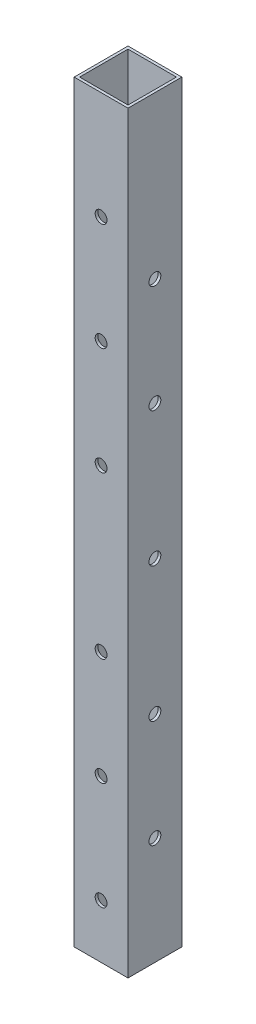
ISO-10303-21;
HEADER;
FILE_DESCRIPTION(('STEP AP214'),'2;1');
FILE_NAME('part.step','',(''),(''),'','','');
FILE_SCHEMA(('AUTOMOTIVE_DESIGN { 1 0 10303 214 1 1 1 1 }'));
ENDSEC;
DATA;
#1=APPLICATION_CONTEXT('core data for automotive mechanical design processes');
#2=APPLICATION_PROTOCOL_DEFINITION('international standard','automotive_design',2000,#1);
#3=PRODUCT_CONTEXT('',#1,'mechanical');
#4=PRODUCT('Part','Part','',(#3));
#5=PRODUCT_RELATED_PRODUCT_CATEGORY('part','',(#4));
#6=PRODUCT_DEFINITION_FORMATION('','',#4);
#7=PRODUCT_DEFINITION_CONTEXT('part definition',#1,'design');
#8=PRODUCT_DEFINITION('design','',#6,#7);
#9=PRODUCT_DEFINITION_SHAPE('','',#8);
#10=(LENGTH_UNIT() NAMED_UNIT(*) SI_UNIT(.MILLI.,.METRE.));
#11=(NAMED_UNIT(*) PLANE_ANGLE_UNIT() SI_UNIT($,.RADIAN.));
#12=(NAMED_UNIT(*) SI_UNIT($,.STERADIAN.) SOLID_ANGLE_UNIT());
#13=UNCERTAINTY_MEASURE_WITH_UNIT(LENGTH_MEASURE(1.E-05),#10,'distance_accuracy_value','');
#14=(GEOMETRIC_REPRESENTATION_CONTEXT(3) GLOBAL_UNCERTAINTY_ASSIGNED_CONTEXT((#13)) GLOBAL_UNIT_ASSIGNED_CONTEXT((#10,
#11,#12)) REPRESENTATION_CONTEXT('',''));
#15=CARTESIAN_POINT('',(0.,0.,0.));
#16=DIRECTION('',(0.,0.,1.));
#17=DIRECTION('',(1.,0.,0.));
#18=AXIS2_PLACEMENT_3D('',#15,#16,#17);
#19=CARTESIAN_POINT('',(0.,-280.,10.));
#20=DIRECTION('',(0.,0.,1.));
#21=DIRECTION('',(1.,0.,0.));
#22=AXIS2_PLACEMENT_3D('',#19,#20,#21);
#23=PLANE('',#22);
#24=CARTESIAN_POINT('',(0.,-40.,10.));
#25=DIRECTION('',(0.,0.,1.));
#26=DIRECTION('',(1.,0.,0.));
#27=AXIS2_PLACEMENT_3D('',#24,#25,#26);
#28=CIRCLE('',#27,2.2);
#29=CARTESIAN_POINT('',(2.19999999999997,-40.,10.));
#30=VERTEX_POINT('',#29);
#31=EDGE_CURVE('E201',#30,#30,#28,.T.);
#32=ORIENTED_EDGE('',*,*,#31,.F.);
#33=EDGE_LOOP('',(#32));
#34=FACE_BOUND('',#33,.T.);
#35=CARTESIAN_POINT('',(1.85733876412832E-12,-220.,10.));
#36=DIRECTION('',(0.,0.,1.));
#37=DIRECTION('',(1.,0.,0.));
#38=AXIS2_PLACEMENT_3D('',#35,#36,#37);
#39=CIRCLE('',#38,2.19999999999999);
#40=CARTESIAN_POINT('',(2.20000000000185,-220.,10.));
#41=VERTEX_POINT('',#40);
#42=EDGE_CURVE('E278',#41,#41,#39,.T.);
#43=ORIENTED_EDGE('',*,*,#42,.F.);
#44=EDGE_LOOP('',(#43));
#45=FACE_BOUND('',#44,.T.);
#46=CARTESIAN_POINT('',(8.09894362475382E-13,-120.,10.));
#47=DIRECTION('',(0.,0.,1.));
#48=DIRECTION('',(1.,0.,0.));
#49=AXIS2_PLACEMENT_3D('',#46,#47,#48);
#50=CIRCLE('',#49,2.2);
#51=CARTESIAN_POINT('',(2.20000000000081,-120.,10.));
#52=VERTEX_POINT('',#51);
#53=EDGE_CURVE('E273',#52,#52,#50,.T.);
#54=ORIENTED_EDGE('',*,*,#53,.F.);
#55=EDGE_LOOP('',(#54));
#56=FACE_BOUND('',#55,.T.);
#57=CARTESIAN_POINT('',(3.90916601814206E-13,-80.,10.));
#58=DIRECTION('',(0.,0.,1.));
#59=DIRECTION('',(1.,0.,0.));
#60=AXIS2_PLACEMENT_3D('',#57,#58,#59);
#61=CIRCLE('',#60,2.2);
#62=CARTESIAN_POINT('',(2.20000000000039,-80.,10.));
#63=VERTEX_POINT('',#62);
#64=EDGE_CURVE('E277',#63,#63,#61,.T.);
#65=ORIENTED_EDGE('',*,*,#64,.F.);
#66=EDGE_LOOP('',(#65));
#67=FACE_BOUND('',#66,.T.);
#68=CARTESIAN_POINT('',(1.43836100346715E-12,-180.,10.));
#69=DIRECTION('',(0.,0.,1.));
#70=DIRECTION('',(1.,0.,0.));
#71=AXIS2_PLACEMENT_3D('',#68,#69,#70);
#72=CIRCLE('',#71,2.19999999999999);
#73=CARTESIAN_POINT('',(2.20000000000143,-180.,10.));
#74=VERTEX_POINT('',#73);
#75=EDGE_CURVE('E272',#74,#74,#72,.T.);
#76=ORIENTED_EDGE('',*,*,#75,.F.);
#77=EDGE_LOOP('',(#76));
#78=FACE_BOUND('',#77,.T.);
#79=CARTESIAN_POINT('',(2.2763165247895E-12,-260.,10.));
#80=DIRECTION('',(0.,0.,1.));
#81=DIRECTION('',(1.,0.,0.));
#82=AXIS2_PLACEMENT_3D('',#79,#80,#81);
#83=CIRCLE('',#82,2.19999999999999);
#84=CARTESIAN_POINT('',(2.20000000000227,-260.,10.));
#85=VERTEX_POINT('',#84);
#86=EDGE_CURVE('E268',#85,#85,#83,.T.);
#87=ORIENTED_EDGE('',*,*,#86,.F.);
#88=EDGE_LOOP('',(#87));
#89=FACE_BOUND('',#88,.T.);
#90=DIRECTION('',(1.,0.,0.));
#91=VECTOR('',#90,1.);
#92=CARTESIAN_POINT('',(0.,0.,10.));
#93=LINE('',#92,#91);
#94=CARTESIAN_POINT('',(-10.0000000000001,0.,9.99999999999993));
#95=VERTEX_POINT('',#94);
#96=CARTESIAN_POINT('',(9.99999999999997,0.,10.));
#97=VERTEX_POINT('',#96);
#98=EDGE_CURVE('E162',#95,#97,#93,.T.);
#99=ORIENTED_EDGE('',*,*,#98,.F.);
#100=DIRECTION('',(0.,1.,0.));
#101=VECTOR('',#100,1.);
#102=CARTESIAN_POINT('',(-10.0000000000001,-280.,9.99999999999993));
#103=LINE('',#102,#101);
#104=CARTESIAN_POINT('',(-10.0000000000001,-280.,9.99999999999993));
#105=VERTEX_POINT('',#104);
#106=EDGE_CURVE('E48',#105,#95,#103,.T.);
#107=ORIENTED_EDGE('',*,*,#106,.F.);
#108=DIRECTION('',(1.,0.,0.));
#109=VECTOR('',#108,1.);
#110=CARTESIAN_POINT('',(0.,-280.,10.));
#111=LINE('',#110,#109);
#112=CARTESIAN_POINT('',(9.99999999999997,-280.,10.));
#113=VERTEX_POINT('',#112);
#114=EDGE_CURVE('E168',#105,#113,#111,.T.);
#115=ORIENTED_EDGE('',*,*,#114,.T.);
#116=DIRECTION('',(0.,1.,0.));
#117=VECTOR('',#116,1.);
#118=CARTESIAN_POINT('',(9.99999999999997,-280.,10.));
#119=LINE('',#118,#117);
#120=EDGE_CURVE('E11',#113,#97,#119,.T.);
#121=ORIENTED_EDGE('',*,*,#120,.T.);
#122=EDGE_LOOP('',(#99,#107,#115,#121));
#123=FACE_BOUND('',#122,.T.);
#124=ADVANCED_FACE('F38',(#34,#45,#56,#67,#78,#89,#123),#23,.T.);
#125=CARTESIAN_POINT('',(-10.,-280.,0.));
#126=DIRECTION('',(-1.,0.,0.));
#127=DIRECTION('',(0.,0.,1.));
#128=AXIS2_PLACEMENT_3D('',#125,#126,#127);
#129=PLANE('',#128);
#130=CARTESIAN_POINT('',(-10.,-60.,0.));
#131=DIRECTION('',(1.,0.,0.));
#132=DIRECTION('',(0.,0.,-1.));
#133=AXIS2_PLACEMENT_3D('',#130,#131,#132);
#134=CIRCLE('',#133,2.2);
#135=CARTESIAN_POINT('',(-10.,-60.,-2.2));
#136=VERTEX_POINT('',#135);
#137=EDGE_CURVE('E237',#136,#136,#134,.T.);
#138=ORIENTED_EDGE('',*,*,#137,.T.);
#139=EDGE_LOOP('',(#138));
#140=FACE_BOUND('',#139,.T.);
#141=CARTESIAN_POINT('',(-10.,-100.,0.));
#142=DIRECTION('',(1.,0.,0.));
#143=DIRECTION('',(0.,0.,-1.));
#144=AXIS2_PLACEMENT_3D('',#141,#142,#143);
#145=CIRCLE('',#144,2.2);
#146=CARTESIAN_POINT('',(-10.,-100.,-2.2));
#147=VERTEX_POINT('',#146);
#148=EDGE_CURVE('E496',#147,#147,#145,.T.);
#149=ORIENTED_EDGE('',*,*,#148,.T.);
#150=EDGE_LOOP('',(#149));
#151=FACE_BOUND('',#150,.T.);
#152=CARTESIAN_POINT('',(-10.,-150.,0.));
#153=DIRECTION('',(1.,0.,0.));
#154=DIRECTION('',(0.,0.,-1.));
#155=AXIS2_PLACEMENT_3D('',#152,#153,#154);
#156=CIRCLE('',#155,2.2);
#157=CARTESIAN_POINT('',(-10.,-150.,-2.20000000000001));
#158=VERTEX_POINT('',#157);
#159=EDGE_CURVE('E488',#158,#158,#156,.T.);
#160=ORIENTED_EDGE('',*,*,#159,.T.);
#161=EDGE_LOOP('',(#160));
#162=FACE_BOUND('',#161,.T.);
#163=CARTESIAN_POINT('',(-10.,-200.,0.));
#164=DIRECTION('',(1.,0.,0.));
#165=DIRECTION('',(0.,0.,-1.));
#166=AXIS2_PLACEMENT_3D('',#163,#164,#165);
#167=CIRCLE('',#166,2.2);
#168=CARTESIAN_POINT('',(-10.,-200.,-2.20000000000001));
#169=VERTEX_POINT('',#168);
#170=EDGE_CURVE('E480',#169,#169,#167,.T.);
#171=ORIENTED_EDGE('',*,*,#170,.T.);
#172=EDGE_LOOP('',(#171));
#173=FACE_BOUND('',#172,.T.);
#174=CARTESIAN_POINT('',(-10.,-240.,0.));
#175=DIRECTION('',(1.,0.,0.));
#176=DIRECTION('',(0.,0.,-1.));
#177=AXIS2_PLACEMENT_3D('',#174,#175,#176);
#178=CIRCLE('',#177,2.2);
#179=CARTESIAN_POINT('',(-10.,-240.,-2.20000000000001));
#180=VERTEX_POINT('',#179);
#181=EDGE_CURVE('E465',#180,#180,#178,.T.);
#182=ORIENTED_EDGE('',*,*,#181,.T.);
#183=EDGE_LOOP('',(#182));
#184=FACE_BOUND('',#183,.T.);
#185=DIRECTION('',(0.,0.,1.));
#186=VECTOR('',#185,1.);
#187=CARTESIAN_POINT('',(-10.,0.,0.));
#188=LINE('',#187,#186);
#189=CARTESIAN_POINT('',(-9.9999999999999,0.,-10.0000000000001));
#190=VERTEX_POINT('',#189);
#191=EDGE_CURVE('E179',#190,#95,#188,.T.);
#192=ORIENTED_EDGE('',*,*,#191,.F.);
#193=DIRECTION('',(0.,1.,0.));
#194=VECTOR('',#193,1.);
#195=CARTESIAN_POINT('',(-9.9999999999999,-280.,-10.0000000000001));
#196=LINE('',#195,#194);
#197=CARTESIAN_POINT('',(-9.9999999999999,-280.,-10.0000000000001));
#198=VERTEX_POINT('',#197);
#199=EDGE_CURVE('E189',#198,#190,#196,.T.);
#200=ORIENTED_EDGE('',*,*,#199,.F.);
#201=DIRECTION('',(0.,0.,1.));
#202=VECTOR('',#201,1.);
#203=CARTESIAN_POINT('',(-10.,-280.,0.));
#204=LINE('',#203,#202);
#205=EDGE_CURVE('E165',#198,#105,#204,.T.);
#206=ORIENTED_EDGE('',*,*,#205,.T.);
#207=ORIENTED_EDGE('',*,*,#106,.T.);
#208=EDGE_LOOP('',(#192,#200,#206,#207));
#209=FACE_BOUND('',#208,.T.);
#210=ADVANCED_FACE('F333',(#140,#151,#162,#173,#184,#209),#129,.T.);
#211=CARTESIAN_POINT('',(0.,-280.,-10.));
#212=DIRECTION('',(0.,0.,-1.));
#213=DIRECTION('',(-1.,0.,0.));
#214=AXIS2_PLACEMENT_3D('',#211,#212,#213);
#215=PLANE('',#214);
#216=CARTESIAN_POINT('',(0.,-40.,-10.));
#217=DIRECTION('',(0.,0.,-1.));
#218=DIRECTION('',(-1.,0.,0.));
#219=AXIS2_PLACEMENT_3D('',#216,#217,#218);
#220=CIRCLE('',#219,2.2);
#221=CARTESIAN_POINT('',(-2.20000000000003,-40.,-10.));
#222=VERTEX_POINT('',#221);
#223=EDGE_CURVE('E142',#222,#222,#220,.T.);
#224=ORIENTED_EDGE('',*,*,#223,.F.);
#225=EDGE_LOOP('',(#224));
#226=FACE_BOUND('',#225,.T.);
#227=CARTESIAN_POINT('',(1.85733876412832E-12,-220.,-10.));
#228=DIRECTION('',(0.,0.,-1.));
#229=DIRECTION('',(-1.,0.,0.));
#230=AXIS2_PLACEMENT_3D('',#227,#228,#229);
#231=CIRCLE('',#230,2.19999999999999);
#232=CARTESIAN_POINT('',(-2.19999999999814,-220.,-10.));
#233=VERTEX_POINT('',#232);
#234=EDGE_CURVE('E231',#233,#233,#231,.T.);
#235=ORIENTED_EDGE('',*,*,#234,.F.);
#236=EDGE_LOOP('',(#235));
#237=FACE_BOUND('',#236,.T.);
#238=CARTESIAN_POINT('',(8.09894362475382E-13,-120.,-10.));
#239=DIRECTION('',(0.,0.,-1.));
#240=DIRECTION('',(-1.,0.,0.));
#241=AXIS2_PLACEMENT_3D('',#238,#239,#240);
#242=CIRCLE('',#241,2.2);
#243=CARTESIAN_POINT('',(-2.19999999999919,-120.,-10.));
#244=VERTEX_POINT('',#243);
#245=EDGE_CURVE('E225',#244,#244,#242,.T.);
#246=ORIENTED_EDGE('',*,*,#245,.F.);
#247=EDGE_LOOP('',(#246));
#248=FACE_BOUND('',#247,.T.);
#249=CARTESIAN_POINT('',(3.90916601814206E-13,-80.,-10.));
#250=DIRECTION('',(0.,0.,-1.));
#251=DIRECTION('',(-1.,0.,0.));
#252=AXIS2_PLACEMENT_3D('',#249,#250,#251);
#253=CIRCLE('',#252,2.2);
#254=CARTESIAN_POINT('',(-2.19999999999961,-80.,-10.));
#255=VERTEX_POINT('',#254);
#256=EDGE_CURVE('E219',#255,#255,#253,.T.);
#257=ORIENTED_EDGE('',*,*,#256,.F.);
#258=EDGE_LOOP('',(#257));
#259=FACE_BOUND('',#258,.T.);
#260=CARTESIAN_POINT('',(1.43836100346715E-12,-180.,-10.));
#261=DIRECTION('',(0.,0.,-1.));
#262=DIRECTION('',(-1.,0.,0.));
#263=AXIS2_PLACEMENT_3D('',#260,#261,#262);
#264=CIRCLE('',#263,2.19999999999999);
#265=CARTESIAN_POINT('',(-2.19999999999856,-180.,-10.));
#266=VERTEX_POINT('',#265);
#267=EDGE_CURVE('E213',#266,#266,#264,.T.);
#268=ORIENTED_EDGE('',*,*,#267,.F.);
#269=EDGE_LOOP('',(#268));
#270=FACE_BOUND('',#269,.T.);
#271=CARTESIAN_POINT('',(2.2763165247895E-12,-260.,-10.));
#272=DIRECTION('',(0.,0.,-1.));
#273=DIRECTION('',(-1.,0.,0.));
#274=AXIS2_PLACEMENT_3D('',#271,#272,#273);
#275=CIRCLE('',#274,2.19999999999999);
#276=CARTESIAN_POINT('',(-2.19999999999772,-260.,-10.));
#277=VERTEX_POINT('',#276);
#278=EDGE_CURVE('E207',#277,#277,#275,.T.);
#279=ORIENTED_EDGE('',*,*,#278,.F.);
#280=EDGE_LOOP('',(#279));
#281=FACE_BOUND('',#280,.T.);
#282=DIRECTION('',(-1.,0.,0.));
#283=VECTOR('',#282,1.);
#284=CARTESIAN_POINT('',(0.,0.,-10.));
#285=LINE('',#284,#283);
#286=CARTESIAN_POINT('',(10.,0.,-10.));
#287=VERTEX_POINT('',#286);
#288=EDGE_CURVE('E175',#287,#190,#285,.T.);
#289=ORIENTED_EDGE('',*,*,#288,.F.);
#290=DIRECTION('',(0.,1.,0.));
#291=VECTOR('',#290,1.);
#292=CARTESIAN_POINT('',(10.,-280.,-10.));
#293=LINE('',#292,#291);
#294=CARTESIAN_POINT('',(10.,-280.,-10.));
#295=VERTEX_POINT('',#294);
#296=EDGE_CURVE('E171',#295,#287,#293,.T.);
#297=ORIENTED_EDGE('',*,*,#296,.F.);
#298=DIRECTION('',(-1.,0.,0.));
#299=VECTOR('',#298,1.);
#300=CARTESIAN_POINT('',(0.,-280.,-10.));
#301=LINE('',#300,#299);
#302=EDGE_CURVE('E161',#295,#198,#301,.T.);
#303=ORIENTED_EDGE('',*,*,#302,.T.);
#304=ORIENTED_EDGE('',*,*,#199,.T.);
#305=EDGE_LOOP('',(#289,#297,#303,#304));
#306=FACE_BOUND('',#305,.T.);
#307=ADVANCED_FACE('F330',(#226,#237,#248,#259,#270,#281,#306),#215,.T.);
#308=CARTESIAN_POINT('',(10.,-280.,0.));
#309=DIRECTION('',(1.,0.,0.));
#310=DIRECTION('',(0.,0.,-1.));
#311=AXIS2_PLACEMENT_3D('',#308,#309,#310);
#312=PLANE('',#311);
#313=CARTESIAN_POINT('',(10.,-60.,0.));
#314=DIRECTION('',(1.,0.,0.));
#315=DIRECTION('',(0.,0.,-1.));
#316=AXIS2_PLACEMENT_3D('',#313,#314,#315);
#317=CIRCLE('',#316,2.2);
#318=CARTESIAN_POINT('',(10.,-60.,-2.2));
#319=VERTEX_POINT('',#318);
#320=EDGE_CURVE('E500',#319,#319,#317,.T.);
#321=ORIENTED_EDGE('',*,*,#320,.F.);
#322=EDGE_LOOP('',(#321));
#323=FACE_BOUND('',#322,.T.);
#324=CARTESIAN_POINT('',(10.,-100.,0.));
#325=DIRECTION('',(1.,0.,0.));
#326=DIRECTION('',(0.,0.,-1.));
#327=AXIS2_PLACEMENT_3D('',#324,#325,#326);
#328=CIRCLE('',#327,2.2);
#329=CARTESIAN_POINT('',(10.,-100.,-2.2));
#330=VERTEX_POINT('',#329);
#331=EDGE_CURVE('E492',#330,#330,#328,.T.);
#332=ORIENTED_EDGE('',*,*,#331,.F.);
#333=EDGE_LOOP('',(#332));
#334=FACE_BOUND('',#333,.T.);
#335=CARTESIAN_POINT('',(10.,-150.,0.));
#336=DIRECTION('',(1.,0.,0.));
#337=DIRECTION('',(0.,0.,-1.));
#338=AXIS2_PLACEMENT_3D('',#335,#336,#337);
#339=CIRCLE('',#338,2.2);
#340=CARTESIAN_POINT('',(10.,-150.,-2.20000000000001));
#341=VERTEX_POINT('',#340);
#342=EDGE_CURVE('E484',#341,#341,#339,.T.);
#343=ORIENTED_EDGE('',*,*,#342,.F.);
#344=EDGE_LOOP('',(#343));
#345=FACE_BOUND('',#344,.T.);
#346=CARTESIAN_POINT('',(10.,-200.,0.));
#347=DIRECTION('',(1.,0.,0.));
#348=DIRECTION('',(0.,0.,-1.));
#349=AXIS2_PLACEMENT_3D('',#346,#347,#348);
#350=CIRCLE('',#349,2.2);
#351=CARTESIAN_POINT('',(10.,-200.,-2.20000000000001));
#352=VERTEX_POINT('',#351);
#353=EDGE_CURVE('E476',#352,#352,#350,.T.);
#354=ORIENTED_EDGE('',*,*,#353,.F.);
#355=EDGE_LOOP('',(#354));
#356=FACE_BOUND('',#355,.T.);
#357=CARTESIAN_POINT('',(10.,-240.,0.));
#358=DIRECTION('',(1.,0.,0.));
#359=DIRECTION('',(0.,0.,-1.));
#360=AXIS2_PLACEMENT_3D('',#357,#358,#359);
#361=CIRCLE('',#360,2.2);
#362=CARTESIAN_POINT('',(10.,-240.,-2.20000000000001));
#363=VERTEX_POINT('',#362);
#364=EDGE_CURVE('E471',#363,#363,#361,.T.);
#365=ORIENTED_EDGE('',*,*,#364,.F.);
#366=EDGE_LOOP('',(#365));
#367=FACE_BOUND('',#366,.T.);
#368=DIRECTION('',(0.,0.,-1.));
#369=VECTOR('',#368,1.);
#370=CARTESIAN_POINT('',(10.,0.,0.));
#371=LINE('',#370,#369);
#372=EDGE_CURVE('E153',#97,#287,#371,.T.);
#373=ORIENTED_EDGE('',*,*,#372,.F.);
#374=ORIENTED_EDGE('',*,*,#120,.F.);
#375=DIRECTION('',(0.,0.,-1.));
#376=VECTOR('',#375,1.);
#377=CARTESIAN_POINT('',(10.,-280.,0.));
#378=LINE('',#377,#376);
#379=EDGE_CURVE('E158',#113,#295,#378,.T.);
#380=ORIENTED_EDGE('',*,*,#379,.T.);
#381=ORIENTED_EDGE('',*,*,#296,.T.);
#382=EDGE_LOOP('',(#373,#374,#380,#381));
#383=FACE_BOUND('',#382,.T.);
#384=ADVANCED_FACE('F40',(#323,#334,#345,#356,#367,#383),#312,.T.);
#385=CARTESIAN_POINT('',(0.,-280.,0.));
#386=DIRECTION('',(0.,1.,0.));
#387=DIRECTION('',(0.,0.,1.));
#388=AXIS2_PLACEMENT_3D('',#385,#386,#387);
#389=PLANE('',#388);
#390=DIRECTION('',(0.,0.,1.));
#391=VECTOR('',#390,1.);
#392=CARTESIAN_POINT('',(-9.,-280.,0.));
#393=LINE('',#392,#391);
#394=CARTESIAN_POINT('',(-8.99999999999991,-280.,-9.00000000000009));
#395=VERTEX_POINT('',#394);
#396=CARTESIAN_POINT('',(-9.00000000000006,-280.,8.99999999999994));
#397=VERTEX_POINT('',#396);
#398=EDGE_CURVE('E117',#395,#397,#393,.T.);
#399=ORIENTED_EDGE('',*,*,#398,.T.);
#400=DIRECTION('',(1.,0.,0.));
#401=VECTOR('',#400,1.);
#402=CARTESIAN_POINT('',(0.,-280.,9.));
#403=LINE('',#402,#401);
#404=CARTESIAN_POINT('',(8.99999999999997,-280.,9.00000000000003));
#405=VERTEX_POINT('',#404);
#406=EDGE_CURVE('E123',#397,#405,#403,.T.);
#407=ORIENTED_EDGE('',*,*,#406,.T.);
#408=DIRECTION('',(0.,0.,-1.));
#409=VECTOR('',#408,1.);
#410=CARTESIAN_POINT('',(9.,-280.,0.));
#411=LINE('',#410,#409);
#412=CARTESIAN_POINT('',(9.,-280.,-9.));
#413=VERTEX_POINT('',#412);
#414=EDGE_CURVE('E129',#405,#413,#411,.T.);
#415=ORIENTED_EDGE('',*,*,#414,.T.);
#416=DIRECTION('',(-1.,0.,0.));
#417=VECTOR('',#416,1.);
#418=CARTESIAN_POINT('',(0.,-280.,-9.));
#419=LINE('',#418,#417);
#420=EDGE_CURVE('E56',#413,#395,#419,.T.);
#421=ORIENTED_EDGE('',*,*,#420,.T.);
#422=EDGE_LOOP('',(#399,#407,#415,#421));
#423=FACE_BOUND('',#422,.T.);
#424=ORIENTED_EDGE('',*,*,#379,.F.);
#425=ORIENTED_EDGE('',*,*,#114,.F.);
#426=ORIENTED_EDGE('',*,*,#205,.F.);
#427=ORIENTED_EDGE('',*,*,#302,.F.);
#428=EDGE_LOOP('',(#424,#425,#426,#427));
#429=FACE_BOUND('',#428,.T.);
#430=ADVANCED_FACE('F126',(#423,#429),#389,.F.);
#431=CARTESIAN_POINT('',(0.,0.,0.));
#432=DIRECTION('',(0.,1.,0.));
#433=DIRECTION('',(0.,0.,1.));
#434=AXIS2_PLACEMENT_3D('',#431,#432,#433);
#435=PLANE('',#434);
#436=DIRECTION('',(1.,0.,0.));
#437=VECTOR('',#436,1.);
#438=CARTESIAN_POINT('',(0.,0.,9.));
#439=LINE('',#438,#437);
#440=CARTESIAN_POINT('',(-9.00000000000006,0.,8.99999999999994));
#441=VERTEX_POINT('',#440);
#442=CARTESIAN_POINT('',(9.,0.,9.00000000000003));
#443=VERTEX_POINT('',#442);
#444=EDGE_CURVE('E64',#441,#443,#439,.T.);
#445=ORIENTED_EDGE('',*,*,#444,.F.);
#446=DIRECTION('',(0.,0.,1.));
#447=VECTOR('',#446,1.);
#448=CARTESIAN_POINT('',(-9.,0.,0.));
#449=LINE('',#448,#447);
#450=CARTESIAN_POINT('',(-8.99999999999991,0.,-9.00000000000009));
#451=VERTEX_POINT('',#450);
#452=EDGE_CURVE('E145',#451,#441,#449,.T.);
#453=ORIENTED_EDGE('',*,*,#452,.F.);
#454=DIRECTION('',(-1.,0.,0.));
#455=VECTOR('',#454,1.);
#456=CARTESIAN_POINT('',(0.,0.,-9.));
#457=LINE('',#456,#455);
#458=CARTESIAN_POINT('',(9.,0.,-9.));
#459=VERTEX_POINT('',#458);
#460=EDGE_CURVE('E108',#459,#451,#457,.T.);
#461=ORIENTED_EDGE('',*,*,#460,.F.);
#462=DIRECTION('',(0.,0.,-1.));
#463=VECTOR('',#462,1.);
#464=CARTESIAN_POINT('',(9.,0.,0.));
#465=LINE('',#464,#463);
#466=EDGE_CURVE('E138',#443,#459,#465,.T.);
#467=ORIENTED_EDGE('',*,*,#466,.F.);
#468=EDGE_LOOP('',(#445,#453,#461,#467));
#469=FACE_BOUND('',#468,.T.);
#470=ORIENTED_EDGE('',*,*,#98,.T.);
#471=ORIENTED_EDGE('',*,*,#372,.T.);
#472=ORIENTED_EDGE('',*,*,#288,.T.);
#473=ORIENTED_EDGE('',*,*,#191,.T.);
#474=EDGE_LOOP('',(#470,#471,#472,#473));
#475=FACE_BOUND('',#474,.T.);
#476=ADVANCED_FACE('F351',(#469,#475),#435,.T.);
#477=CARTESIAN_POINT('',(0.,-280.,9.));
#478=DIRECTION('',(0.,0.,1.));
#479=DIRECTION('',(1.,0.,0.));
#480=AXIS2_PLACEMENT_3D('',#477,#478,#479);
#481=PLANE('',#480);
#482=CARTESIAN_POINT('',(0.,-40.,9.00000000000001));
#483=DIRECTION('',(0.,0.,1.));
#484=DIRECTION('',(1.,0.,0.));
#485=AXIS2_PLACEMENT_3D('',#482,#483,#484);
#486=CIRCLE('',#485,2.2);
#487=CARTESIAN_POINT('',(2.19999999999997,-40.,9.00000000000001));
#488=VERTEX_POINT('',#487);
#489=EDGE_CURVE('E230',#488,#488,#486,.T.);
#490=ORIENTED_EDGE('',*,*,#489,.T.);
#491=EDGE_LOOP('',(#490));
#492=FACE_BOUND('',#491,.T.);
#493=CARTESIAN_POINT('',(1.85733876412832E-12,-220.,9.00000000000001));
#494=DIRECTION('',(0.,0.,1.));
#495=DIRECTION('',(1.,0.,0.));
#496=AXIS2_PLACEMENT_3D('',#493,#494,#495);
#497=CIRCLE('',#496,2.19999999999999);
#498=CARTESIAN_POINT('',(2.20000000000185,-220.,9.00000000000001));
#499=VERTEX_POINT('',#498);
#500=EDGE_CURVE('E224',#499,#499,#497,.T.);
#501=ORIENTED_EDGE('',*,*,#500,.T.);
#502=EDGE_LOOP('',(#501));
#503=FACE_BOUND('',#502,.T.);
#504=CARTESIAN_POINT('',(8.09894362475382E-13,-120.,9.00000000000001));
#505=DIRECTION('',(0.,0.,1.));
#506=DIRECTION('',(1.,0.,0.));
#507=AXIS2_PLACEMENT_3D('',#504,#505,#506);
#508=CIRCLE('',#507,2.2);
#509=CARTESIAN_POINT('',(2.20000000000081,-120.,9.00000000000001));
#510=VERTEX_POINT('',#509);
#511=EDGE_CURVE('E218',#510,#510,#508,.T.);
#512=ORIENTED_EDGE('',*,*,#511,.T.);
#513=EDGE_LOOP('',(#512));
#514=FACE_BOUND('',#513,.T.);
#515=CARTESIAN_POINT('',(3.90916601814206E-13,-80.,9.00000000000001));
#516=DIRECTION('',(0.,0.,1.));
#517=DIRECTION('',(1.,0.,0.));
#518=AXIS2_PLACEMENT_3D('',#515,#516,#517);
#519=CIRCLE('',#518,2.2);
#520=CARTESIAN_POINT('',(2.20000000000039,-80.,9.00000000000001));
#521=VERTEX_POINT('',#520);
#522=EDGE_CURVE('E212',#521,#521,#519,.T.);
#523=ORIENTED_EDGE('',*,*,#522,.T.);
#524=EDGE_LOOP('',(#523));
#525=FACE_BOUND('',#524,.T.);
#526=CARTESIAN_POINT('',(1.43836100346715E-12,-180.,9.00000000000001));
#527=DIRECTION('',(0.,0.,1.));
#528=DIRECTION('',(1.,0.,0.));
#529=AXIS2_PLACEMENT_3D('',#526,#527,#528);
#530=CIRCLE('',#529,2.19999999999999);
#531=CARTESIAN_POINT('',(2.20000000000143,-180.,9.00000000000001));
#532=VERTEX_POINT('',#531);
#533=EDGE_CURVE('E206',#532,#532,#530,.T.);
#534=ORIENTED_EDGE('',*,*,#533,.T.);
#535=EDGE_LOOP('',(#534));
#536=FACE_BOUND('',#535,.T.);
#537=CARTESIAN_POINT('',(2.2763165247895E-12,-260.,9.00000000000001));
#538=DIRECTION('',(0.,0.,1.));
#539=DIRECTION('',(1.,0.,0.));
#540=AXIS2_PLACEMENT_3D('',#537,#538,#539);
#541=CIRCLE('',#540,2.19999999999999);
#542=CARTESIAN_POINT('',(2.20000000000227,-260.,9.00000000000001));
#543=VERTEX_POINT('',#542);
#544=EDGE_CURVE('E200',#543,#543,#541,.T.);
#545=ORIENTED_EDGE('',*,*,#544,.T.);
#546=EDGE_LOOP('',(#545));
#547=FACE_BOUND('',#546,.T.);
#548=ORIENTED_EDGE('',*,*,#444,.T.);
#549=DIRECTION('',(0.,1.,0.));
#550=VECTOR('',#549,1.);
#551=CARTESIAN_POINT('',(8.99999999999997,-280.,9.00000000000003));
#552=LINE('',#551,#550);
#553=EDGE_CURVE('E150',#405,#443,#552,.T.);
#554=ORIENTED_EDGE('',*,*,#553,.F.);
#555=ORIENTED_EDGE('',*,*,#406,.F.);
#556=DIRECTION('',(0.,1.,0.));
#557=VECTOR('',#556,1.);
#558=CARTESIAN_POINT('',(-9.00000000000006,-280.,8.99999999999994));
#559=LINE('',#558,#557);
#560=EDGE_CURVE('E113',#397,#441,#559,.T.);
#561=ORIENTED_EDGE('',*,*,#560,.T.);
#562=EDGE_LOOP('',(#548,#554,#555,#561));
#563=FACE_BOUND('',#562,.T.);
#564=ADVANCED_FACE('F363',(#492,#503,#514,#525,#536,#547,#563),#481,.F.);
#565=CARTESIAN_POINT('',(-9.,-280.,0.));
#566=DIRECTION('',(-1.,0.,0.));
#567=DIRECTION('',(0.,0.,1.));
#568=AXIS2_PLACEMENT_3D('',#565,#566,#567);
#569=PLANE('',#568);
#570=CARTESIAN_POINT('',(-9.,-60.,0.));
#571=DIRECTION('',(-1.,0.,0.));
#572=DIRECTION('',(0.,0.,1.));
#573=AXIS2_PLACEMENT_3D('',#570,#571,#572);
#574=CIRCLE('',#573,2.2);
#575=CARTESIAN_POINT('',(-9.00000000000001,-60.,2.2));
#576=VERTEX_POINT('',#575);
#577=EDGE_CURVE('E264',#576,#576,#574,.T.);
#578=ORIENTED_EDGE('',*,*,#577,.T.);
#579=EDGE_LOOP('',(#578));
#580=FACE_BOUND('',#579,.T.);
#581=CARTESIAN_POINT('',(-9.,-100.,0.));
#582=DIRECTION('',(-1.,0.,0.));
#583=DIRECTION('',(0.,0.,1.));
#584=AXIS2_PLACEMENT_3D('',#581,#582,#583);
#585=CIRCLE('',#584,2.2);
#586=CARTESIAN_POINT('',(-9.00000000000001,-100.,2.19999999999999));
#587=VERTEX_POINT('',#586);
#588=EDGE_CURVE('E250',#587,#587,#585,.T.);
#589=ORIENTED_EDGE('',*,*,#588,.T.);
#590=EDGE_LOOP('',(#589));
#591=FACE_BOUND('',#590,.T.);
#592=CARTESIAN_POINT('',(-9.,-150.,0.));
#593=DIRECTION('',(-1.,0.,0.));
#594=DIRECTION('',(0.,0.,1.));
#595=AXIS2_PLACEMENT_3D('',#592,#593,#594);
#596=CIRCLE('',#595,2.2);
#597=CARTESIAN_POINT('',(-9.00000000000001,-150.,2.2));
#598=VERTEX_POINT('',#597);
#599=EDGE_CURVE('E246',#598,#598,#596,.T.);
#600=ORIENTED_EDGE('',*,*,#599,.T.);
#601=EDGE_LOOP('',(#600));
#602=FACE_BOUND('',#601,.T.);
#603=CARTESIAN_POINT('',(-9.,-200.,0.));
#604=DIRECTION('',(-1.,0.,0.));
#605=DIRECTION('',(0.,0.,1.));
#606=AXIS2_PLACEMENT_3D('',#603,#604,#605);
#607=CIRCLE('',#606,2.2);
#608=CARTESIAN_POINT('',(-9.00000000000001,-200.,2.2));
#609=VERTEX_POINT('',#608);
#610=EDGE_CURVE('E242',#609,#609,#607,.T.);
#611=ORIENTED_EDGE('',*,*,#610,.T.);
#612=EDGE_LOOP('',(#611));
#613=FACE_BOUND('',#612,.T.);
#614=CARTESIAN_POINT('',(-9.,-240.,0.));
#615=DIRECTION('',(-1.,0.,0.));
#616=DIRECTION('',(0.,0.,1.));
#617=AXIS2_PLACEMENT_3D('',#614,#615,#616);
#618=CIRCLE('',#617,2.2);
#619=CARTESIAN_POINT('',(-9.00000000000001,-240.,2.2));
#620=VERTEX_POINT('',#619);
#621=EDGE_CURVE('E236',#620,#620,#618,.T.);
#622=ORIENTED_EDGE('',*,*,#621,.T.);
#623=EDGE_LOOP('',(#622));
#624=FACE_BOUND('',#623,.T.);
#625=ORIENTED_EDGE('',*,*,#452,.T.);
#626=ORIENTED_EDGE('',*,*,#560,.F.);
#627=ORIENTED_EDGE('',*,*,#398,.F.);
#628=DIRECTION('',(0.,1.,0.));
#629=VECTOR('',#628,1.);
#630=CARTESIAN_POINT('',(-8.99999999999991,-280.,-9.00000000000009));
#631=LINE('',#630,#629);
#632=EDGE_CURVE('E104',#395,#451,#631,.T.);
#633=ORIENTED_EDGE('',*,*,#632,.T.);
#634=EDGE_LOOP('',(#625,#626,#627,#633));
#635=FACE_BOUND('',#634,.T.);
#636=ADVANCED_FACE('F118',(#580,#591,#602,#613,#624,#635),#569,.F.);
#637=CARTESIAN_POINT('',(0.,-280.,-9.));
#638=DIRECTION('',(0.,0.,-1.));
#639=DIRECTION('',(-1.,0.,0.));
#640=AXIS2_PLACEMENT_3D('',#637,#638,#639);
#641=PLANE('',#640);
#642=CARTESIAN_POINT('',(0.,-40.,-9.00000000000001));
#643=DIRECTION('',(0.,0.,-1.));
#644=DIRECTION('',(-1.,0.,0.));
#645=AXIS2_PLACEMENT_3D('',#642,#643,#644);
#646=CIRCLE('',#645,2.2);
#647=CARTESIAN_POINT('',(-2.20000000000003,-40.,-9.00000000000003));
#648=VERTEX_POINT('',#647);
#649=EDGE_CURVE('E226',#648,#648,#646,.T.);
#650=ORIENTED_EDGE('',*,*,#649,.T.);
#651=EDGE_LOOP('',(#650));
#652=FACE_BOUND('',#651,.T.);
#653=CARTESIAN_POINT('',(1.85733876412832E-12,-220.,-9.00000000000001));
#654=DIRECTION('',(0.,0.,-1.));
#655=DIRECTION('',(-1.,0.,0.));
#656=AXIS2_PLACEMENT_3D('',#653,#654,#655);
#657=CIRCLE('',#656,2.19999999999999);
#658=CARTESIAN_POINT('',(-2.19999999999814,-220.,-9.00000000000003));
#659=VERTEX_POINT('',#658);
#660=EDGE_CURVE('E220',#659,#659,#657,.T.);
#661=ORIENTED_EDGE('',*,*,#660,.T.);
#662=EDGE_LOOP('',(#661));
#663=FACE_BOUND('',#662,.T.);
#664=CARTESIAN_POINT('',(8.09894362475382E-13,-120.,-9.00000000000001));
#665=DIRECTION('',(0.,0.,-1.));
#666=DIRECTION('',(-1.,0.,0.));
#667=AXIS2_PLACEMENT_3D('',#664,#665,#666);
#668=CIRCLE('',#667,2.2);
#669=CARTESIAN_POINT('',(-2.19999999999919,-120.,-9.00000000000003));
#670=VERTEX_POINT('',#669);
#671=EDGE_CURVE('E214',#670,#670,#668,.T.);
#672=ORIENTED_EDGE('',*,*,#671,.T.);
#673=EDGE_LOOP('',(#672));
#674=FACE_BOUND('',#673,.T.);
#675=CARTESIAN_POINT('',(3.90916601814206E-13,-80.,-9.00000000000001));
#676=DIRECTION('',(0.,0.,-1.));
#677=DIRECTION('',(-1.,0.,0.));
#678=AXIS2_PLACEMENT_3D('',#675,#676,#677);
#679=CIRCLE('',#678,2.2);
#680=CARTESIAN_POINT('',(-2.19999999999961,-80.,-9.00000000000003));
#681=VERTEX_POINT('',#680);
#682=EDGE_CURVE('E208',#681,#681,#679,.T.);
#683=ORIENTED_EDGE('',*,*,#682,.T.);
#684=EDGE_LOOP('',(#683));
#685=FACE_BOUND('',#684,.T.);
#686=CARTESIAN_POINT('',(1.43836100346715E-12,-180.,-9.00000000000001));
#687=DIRECTION('',(0.,0.,-1.));
#688=DIRECTION('',(-1.,0.,0.));
#689=AXIS2_PLACEMENT_3D('',#686,#687,#688);
#690=CIRCLE('',#689,2.19999999999999);
#691=CARTESIAN_POINT('',(-2.19999999999856,-180.,-9.00000000000003));
#692=VERTEX_POINT('',#691);
#693=EDGE_CURVE('E202',#692,#692,#690,.T.);
#694=ORIENTED_EDGE('',*,*,#693,.T.);
#695=EDGE_LOOP('',(#694));
#696=FACE_BOUND('',#695,.T.);
#697=CARTESIAN_POINT('',(2.2763165247895E-12,-260.,-9.00000000000001));
#698=DIRECTION('',(0.,0.,-1.));
#699=DIRECTION('',(-1.,0.,0.));
#700=AXIS2_PLACEMENT_3D('',#697,#698,#699);
#701=CIRCLE('',#700,2.19999999999999);
#702=CARTESIAN_POINT('',(-2.19999999999772,-260.,-9.00000000000003));
#703=VERTEX_POINT('',#702);
#704=EDGE_CURVE('E196',#703,#703,#701,.T.);
#705=ORIENTED_EDGE('',*,*,#704,.T.);
#706=EDGE_LOOP('',(#705));
#707=FACE_BOUND('',#706,.T.);
#708=ORIENTED_EDGE('',*,*,#460,.T.);
#709=ORIENTED_EDGE('',*,*,#632,.F.);
#710=ORIENTED_EDGE('',*,*,#420,.F.);
#711=DIRECTION('',(0.,1.,0.));
#712=VECTOR('',#711,1.);
#713=CARTESIAN_POINT('',(9.,-280.,-9.));
#714=LINE('',#713,#712);
#715=EDGE_CURVE('E114',#413,#459,#714,.T.);
#716=ORIENTED_EDGE('',*,*,#715,.T.);
#717=EDGE_LOOP('',(#708,#709,#710,#716));
#718=FACE_BOUND('',#717,.T.);
#719=ADVANCED_FACE('F106',(#652,#663,#674,#685,#696,#707,#718),#641,.F.);
#720=CARTESIAN_POINT('',(9.,-280.,0.));
#721=DIRECTION('',(1.,0.,0.));
#722=DIRECTION('',(0.,0.,-1.));
#723=AXIS2_PLACEMENT_3D('',#720,#721,#722);
#724=PLANE('',#723);
#725=CARTESIAN_POINT('',(9.,-60.,0.));
#726=DIRECTION('',(1.,0.,0.));
#727=DIRECTION('',(0.,0.,-1.));
#728=AXIS2_PLACEMENT_3D('',#725,#726,#727);
#729=CIRCLE('',#728,2.2);
#730=CARTESIAN_POINT('',(9.,-60.,-2.2));
#731=VERTEX_POINT('',#730);
#732=EDGE_CURVE('E42',#731,#731,#729,.T.);
#733=ORIENTED_EDGE('',*,*,#732,.T.);
#734=EDGE_LOOP('',(#733));
#735=FACE_BOUND('',#734,.T.);
#736=CARTESIAN_POINT('',(9.,-100.,0.));
#737=DIRECTION('',(1.,0.,0.));
#738=DIRECTION('',(0.,0.,-1.));
#739=AXIS2_PLACEMENT_3D('',#736,#737,#738);
#740=CIRCLE('',#739,2.2);
#741=CARTESIAN_POINT('',(9.,-100.,-2.2));
#742=VERTEX_POINT('',#741);
#743=EDGE_CURVE('E247',#742,#742,#740,.T.);
#744=ORIENTED_EDGE('',*,*,#743,.T.);
#745=EDGE_LOOP('',(#744));
#746=FACE_BOUND('',#745,.T.);
#747=CARTESIAN_POINT('',(9.,-150.,0.));
#748=DIRECTION('',(1.,0.,0.));
#749=DIRECTION('',(0.,0.,-1.));
#750=AXIS2_PLACEMENT_3D('',#747,#748,#749);
#751=CIRCLE('',#750,2.2);
#752=CARTESIAN_POINT('',(9.,-150.,-2.20000000000001));
#753=VERTEX_POINT('',#752);
#754=EDGE_CURVE('E243',#753,#753,#751,.T.);
#755=ORIENTED_EDGE('',*,*,#754,.T.);
#756=EDGE_LOOP('',(#755));
#757=FACE_BOUND('',#756,.T.);
#758=CARTESIAN_POINT('',(9.,-200.,0.));
#759=DIRECTION('',(1.,0.,0.));
#760=DIRECTION('',(0.,0.,-1.));
#761=AXIS2_PLACEMENT_3D('',#758,#759,#760);
#762=CIRCLE('',#761,2.2);
#763=CARTESIAN_POINT('',(9.,-200.,-2.20000000000001));
#764=VERTEX_POINT('',#763);
#765=EDGE_CURVE('E238',#764,#764,#762,.T.);
#766=ORIENTED_EDGE('',*,*,#765,.T.);
#767=EDGE_LOOP('',(#766));
#768=FACE_BOUND('',#767,.T.);
#769=CARTESIAN_POINT('',(9.,-240.,0.));
#770=DIRECTION('',(1.,0.,0.));
#771=DIRECTION('',(0.,0.,-1.));
#772=AXIS2_PLACEMENT_3D('',#769,#770,#771);
#773=CIRCLE('',#772,2.2);
#774=CARTESIAN_POINT('',(9.,-240.,-2.20000000000001));
#775=VERTEX_POINT('',#774);
#776=EDGE_CURVE('E232',#775,#775,#773,.T.);
#777=ORIENTED_EDGE('',*,*,#776,.T.);
#778=EDGE_LOOP('',(#777));
#779=FACE_BOUND('',#778,.T.);
#780=ORIENTED_EDGE('',*,*,#466,.T.);
#781=ORIENTED_EDGE('',*,*,#715,.F.);
#782=ORIENTED_EDGE('',*,*,#414,.F.);
#783=ORIENTED_EDGE('',*,*,#553,.T.);
#784=EDGE_LOOP('',(#780,#781,#782,#783));
#785=FACE_BOUND('',#784,.T.);
#786=ADVANCED_FACE('F410',(#735,#746,#757,#768,#779,#785),#724,.F.);
#787=CARTESIAN_POINT('',(2.2763165247895E-12,-260.,-270.));
#788=DIRECTION('',(0.,0.,1.));
#789=DIRECTION('',(1.,0.,0.));
#790=AXIS2_PLACEMENT_3D('',#787,#788,#789);
#791=CYLINDRICAL_SURFACE('',#790,2.19999999999999);
#792=ORIENTED_EDGE('',*,*,#278,.T.);
#793=EDGE_LOOP('',(#792));
#794=FACE_BOUND('',#793,.T.);
#795=ORIENTED_EDGE('',*,*,#704,.F.);
#796=EDGE_LOOP('',(#795));
#797=FACE_BOUND('',#796,.T.);
#798=ADVANCED_FACE('F395',(#794,#797),#791,.F.);
#799=CARTESIAN_POINT('',(1.43836100346715E-12,-180.,-270.));
#800=DIRECTION('',(0.,0.,1.));
#801=DIRECTION('',(1.,0.,0.));
#802=AXIS2_PLACEMENT_3D('',#799,#800,#801);
#803=CYLINDRICAL_SURFACE('',#802,2.19999999999999);
#804=ORIENTED_EDGE('',*,*,#267,.T.);
#805=EDGE_LOOP('',(#804));
#806=FACE_BOUND('',#805,.T.);
#807=ORIENTED_EDGE('',*,*,#693,.F.);
#808=EDGE_LOOP('',(#807));
#809=FACE_BOUND('',#808,.T.);
#810=ADVANCED_FACE('F418',(#806,#809),#803,.F.);
#811=CARTESIAN_POINT('',(3.90916601814206E-13,-80.,-270.));
#812=DIRECTION('',(0.,0.,1.));
#813=DIRECTION('',(1.,0.,0.));
#814=AXIS2_PLACEMENT_3D('',#811,#812,#813);
#815=CYLINDRICAL_SURFACE('',#814,2.2);
#816=ORIENTED_EDGE('',*,*,#256,.T.);
#817=EDGE_LOOP('',(#816));
#818=FACE_BOUND('',#817,.T.);
#819=ORIENTED_EDGE('',*,*,#682,.F.);
#820=EDGE_LOOP('',(#819));
#821=FACE_BOUND('',#820,.T.);
#822=ADVANCED_FACE('F593',(#818,#821),#815,.F.);
#823=CARTESIAN_POINT('',(8.09894362475382E-13,-120.,-270.));
#824=DIRECTION('',(0.,0.,1.));
#825=DIRECTION('',(1.,0.,0.));
#826=AXIS2_PLACEMENT_3D('',#823,#824,#825);
#827=CYLINDRICAL_SURFACE('',#826,2.2);
#828=ORIENTED_EDGE('',*,*,#245,.T.);
#829=EDGE_LOOP('',(#828));
#830=FACE_BOUND('',#829,.T.);
#831=ORIENTED_EDGE('',*,*,#671,.F.);
#832=EDGE_LOOP('',(#831));
#833=FACE_BOUND('',#832,.T.);
#834=ADVANCED_FACE('F585',(#830,#833),#827,.F.);
#835=CARTESIAN_POINT('',(1.85733876412832E-12,-220.,-270.));
#836=DIRECTION('',(0.,0.,1.));
#837=DIRECTION('',(1.,0.,0.));
#838=AXIS2_PLACEMENT_3D('',#835,#836,#837);
#839=CYLINDRICAL_SURFACE('',#838,2.19999999999999);
#840=ORIENTED_EDGE('',*,*,#234,.T.);
#841=EDGE_LOOP('',(#840));
#842=FACE_BOUND('',#841,.T.);
#843=ORIENTED_EDGE('',*,*,#660,.F.);
#844=EDGE_LOOP('',(#843));
#845=FACE_BOUND('',#844,.T.);
#846=ADVANCED_FACE('F575',(#842,#845),#839,.F.);
#847=CARTESIAN_POINT('',(0.,-40.,-270.));
#848=DIRECTION('',(0.,0.,1.));
#849=DIRECTION('',(1.,0.,0.));
#850=AXIS2_PLACEMENT_3D('',#847,#848,#849);
#851=CYLINDRICAL_SURFACE('',#850,2.2);
#852=ORIENTED_EDGE('',*,*,#223,.T.);
#853=EDGE_LOOP('',(#852));
#854=FACE_BOUND('',#853,.T.);
#855=ORIENTED_EDGE('',*,*,#649,.F.);
#856=EDGE_LOOP('',(#855));
#857=FACE_BOUND('',#856,.T.);
#858=ADVANCED_FACE('F327',(#854,#857),#851,.F.);
#859=ORIENTED_EDGE('',*,*,#86,.T.);
#860=EDGE_LOOP('',(#859));
#861=FACE_BOUND('',#860,.T.);
#862=ORIENTED_EDGE('',*,*,#544,.F.);
#863=EDGE_LOOP('',(#862));
#864=FACE_BOUND('',#863,.T.);
#865=ADVANCED_FACE('F390',(#861,#864),#791,.F.);
#866=ORIENTED_EDGE('',*,*,#75,.T.);
#867=EDGE_LOOP('',(#866));
#868=FACE_BOUND('',#867,.T.);
#869=ORIENTED_EDGE('',*,*,#533,.F.);
#870=EDGE_LOOP('',(#869));
#871=FACE_BOUND('',#870,.T.);
#872=ADVANCED_FACE('F393',(#868,#871),#803,.F.);
#873=ORIENTED_EDGE('',*,*,#64,.T.);
#874=EDGE_LOOP('',(#873));
#875=FACE_BOUND('',#874,.T.);
#876=ORIENTED_EDGE('',*,*,#522,.F.);
#877=EDGE_LOOP('',(#876));
#878=FACE_BOUND('',#877,.T.);
#879=ADVANCED_FACE('F582',(#875,#878),#815,.F.);
#880=ORIENTED_EDGE('',*,*,#53,.T.);
#881=EDGE_LOOP('',(#880));
#882=FACE_BOUND('',#881,.T.);
#883=ORIENTED_EDGE('',*,*,#511,.F.);
#884=EDGE_LOOP('',(#883));
#885=FACE_BOUND('',#884,.T.);
#886=ADVANCED_FACE('F572',(#882,#885),#827,.F.);
#887=ORIENTED_EDGE('',*,*,#42,.T.);
#888=EDGE_LOOP('',(#887));
#889=FACE_BOUND('',#888,.T.);
#890=ORIENTED_EDGE('',*,*,#500,.F.);
#891=EDGE_LOOP('',(#890));
#892=FACE_BOUND('',#891,.T.);
#893=ADVANCED_FACE('F445',(#889,#892),#839,.F.);
#894=ORIENTED_EDGE('',*,*,#31,.T.);
#895=EDGE_LOOP('',(#894));
#896=FACE_BOUND('',#895,.T.);
#897=ORIENTED_EDGE('',*,*,#489,.F.);
#898=EDGE_LOOP('',(#897));
#899=FACE_BOUND('',#898,.T.);
#900=ADVANCED_FACE('F434',(#896,#899),#851,.F.);
#901=CARTESIAN_POINT('',(-10.,-240.,0.));
#902=DIRECTION('',(1.,0.,0.));
#903=DIRECTION('',(0.,0.,-1.));
#904=AXIS2_PLACEMENT_3D('',#901,#902,#903);
#905=CYLINDRICAL_SURFACE('',#904,2.2);
#906=ORIENTED_EDGE('',*,*,#364,.T.);
#907=EDGE_LOOP('',(#906));
#908=FACE_BOUND('',#907,.T.);
#909=ORIENTED_EDGE('',*,*,#776,.F.);
#910=EDGE_LOOP('',(#909));
#911=FACE_BOUND('',#910,.T.);
#912=ADVANCED_FACE('F431',(#908,#911),#905,.F.);
#913=CARTESIAN_POINT('',(-10.,-200.,0.));
#914=DIRECTION('',(1.,0.,0.));
#915=DIRECTION('',(0.,0.,-1.));
#916=AXIS2_PLACEMENT_3D('',#913,#914,#915);
#917=CYLINDRICAL_SURFACE('',#916,2.2);
#918=ORIENTED_EDGE('',*,*,#353,.T.);
#919=EDGE_LOOP('',(#918));
#920=FACE_BOUND('',#919,.T.);
#921=ORIENTED_EDGE('',*,*,#765,.F.);
#922=EDGE_LOOP('',(#921));
#923=FACE_BOUND('',#922,.T.);
#924=ADVANCED_FACE('F433',(#920,#923),#917,.F.);
#925=CARTESIAN_POINT('',(-10.,-150.,0.));
#926=DIRECTION('',(1.,0.,0.));
#927=DIRECTION('',(0.,0.,-1.));
#928=AXIS2_PLACEMENT_3D('',#925,#926,#927);
#929=CYLINDRICAL_SURFACE('',#928,2.2);
#930=ORIENTED_EDGE('',*,*,#342,.T.);
#931=EDGE_LOOP('',(#930));
#932=FACE_BOUND('',#931,.T.);
#933=ORIENTED_EDGE('',*,*,#754,.F.);
#934=EDGE_LOOP('',(#933));
#935=FACE_BOUND('',#934,.T.);
#936=ADVANCED_FACE('F441',(#932,#935),#929,.F.);
#937=CARTESIAN_POINT('',(-10.,-100.,0.));
#938=DIRECTION('',(1.,0.,0.));
#939=DIRECTION('',(0.,0.,-1.));
#940=AXIS2_PLACEMENT_3D('',#937,#938,#939);
#941=CYLINDRICAL_SURFACE('',#940,2.2);
#942=ORIENTED_EDGE('',*,*,#331,.T.);
#943=EDGE_LOOP('',(#942));
#944=FACE_BOUND('',#943,.T.);
#945=ORIENTED_EDGE('',*,*,#743,.F.);
#946=EDGE_LOOP('',(#945));
#947=FACE_BOUND('',#946,.T.);
#948=ADVANCED_FACE('F458',(#944,#947),#941,.F.);
#949=CARTESIAN_POINT('',(-10.,-60.,0.));
#950=DIRECTION('',(1.,0.,0.));
#951=DIRECTION('',(0.,0.,-1.));
#952=AXIS2_PLACEMENT_3D('',#949,#950,#951);
#953=CYLINDRICAL_SURFACE('',#952,2.2);
#954=ORIENTED_EDGE('',*,*,#320,.T.);
#955=EDGE_LOOP('',(#954));
#956=FACE_BOUND('',#955,.T.);
#957=ORIENTED_EDGE('',*,*,#732,.F.);
#958=EDGE_LOOP('',(#957));
#959=FACE_BOUND('',#958,.T.);
#960=ADVANCED_FACE('F450',(#956,#959),#953,.F.);
#961=ORIENTED_EDGE('',*,*,#181,.F.);
#962=EDGE_LOOP('',(#961));
#963=FACE_BOUND('',#962,.T.);
#964=ORIENTED_EDGE('',*,*,#621,.F.);
#965=EDGE_LOOP('',(#964));
#966=FACE_BOUND('',#965,.T.);
#967=ADVANCED_FACE('F437',(#963,#966),#905,.F.);
#968=ORIENTED_EDGE('',*,*,#170,.F.);
#969=EDGE_LOOP('',(#968));
#970=FACE_BOUND('',#969,.T.);
#971=ORIENTED_EDGE('',*,*,#610,.F.);
#972=EDGE_LOOP('',(#971));
#973=FACE_BOUND('',#972,.T.);
#974=ADVANCED_FACE('F444',(#970,#973),#917,.F.);
#975=ORIENTED_EDGE('',*,*,#159,.F.);
#976=EDGE_LOOP('',(#975));
#977=FACE_BOUND('',#976,.T.);
#978=ORIENTED_EDGE('',*,*,#599,.F.);
#979=EDGE_LOOP('',(#978));
#980=FACE_BOUND('',#979,.T.);
#981=ADVANCED_FACE('F456',(#977,#980),#929,.F.);
#982=ORIENTED_EDGE('',*,*,#148,.F.);
#983=EDGE_LOOP('',(#982));
#984=FACE_BOUND('',#983,.T.);
#985=ORIENTED_EDGE('',*,*,#588,.F.);
#986=EDGE_LOOP('',(#985));
#987=FACE_BOUND('',#986,.T.);
#988=ADVANCED_FACE('F511',(#984,#987),#941,.F.);
#989=ORIENTED_EDGE('',*,*,#137,.F.);
#990=EDGE_LOOP('',(#989));
#991=FACE_BOUND('',#990,.T.);
#992=ORIENTED_EDGE('',*,*,#577,.F.);
#993=EDGE_LOOP('',(#992));
#994=FACE_BOUND('',#993,.T.);
#995=ADVANCED_FACE('F461',(#991,#994),#953,.F.);
#996=CLOSED_SHELL('',(#124,#210,#307,#384,#430,#476,#564,#636,#719,#786,#798,#810,#822,#834,
#846,#858,#865,#872,#879,#886,#893,#900,#912,#924,#936,#948,#960,#967,#974,#981,#988,#995));
#997=MANIFOLD_SOLID_BREP('B2',#996);
#998=ADVANCED_BREP_SHAPE_REPRESENTATION('',(#18,#997),#14);
#999=SHAPE_DEFINITION_REPRESENTATION(#9,#998);
ENDSEC;
END-ISO-10303-21;
